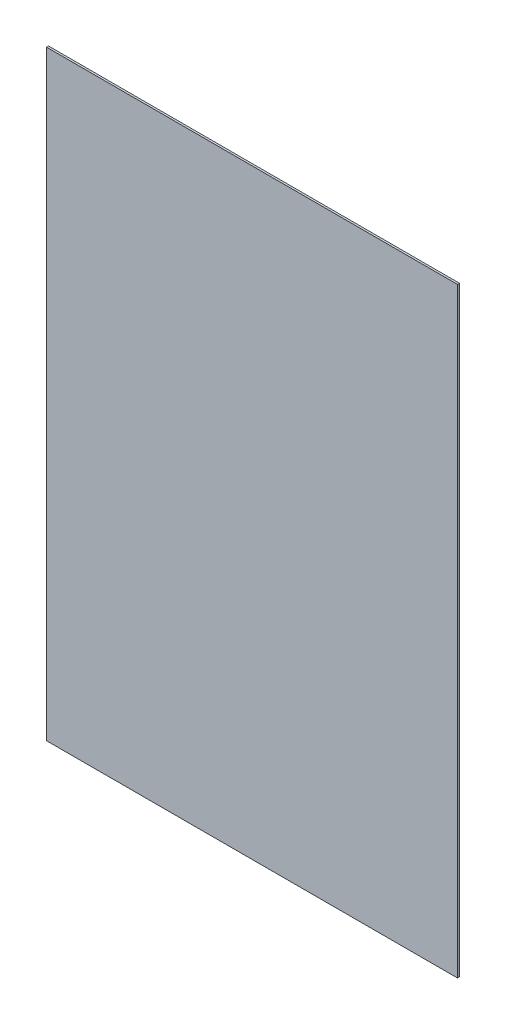
ISO-10303-21;
HEADER;
FILE_DESCRIPTION(('STEP AP214'),'2;1');
FILE_NAME('part.step','',(''),(''),'','','');
FILE_SCHEMA(('AUTOMOTIVE_DESIGN { 1 0 10303 214 1 1 1 1 }'));
ENDSEC;
DATA;
#1=APPLICATION_CONTEXT('core data for automotive mechanical design processes');
#2=APPLICATION_PROTOCOL_DEFINITION('international standard','automotive_design',2000,#1);
#3=PRODUCT_CONTEXT('',#1,'mechanical');
#4=PRODUCT('Part','Part','',(#3));
#5=PRODUCT_RELATED_PRODUCT_CATEGORY('part','',(#4));
#6=PRODUCT_DEFINITION_FORMATION('','',#4);
#7=PRODUCT_DEFINITION_CONTEXT('part definition',#1,'design');
#8=PRODUCT_DEFINITION('design','',#6,#7);
#9=PRODUCT_DEFINITION_SHAPE('','',#8);
#10=(LENGTH_UNIT() NAMED_UNIT(*) SI_UNIT(.MILLI.,.METRE.));
#11=(NAMED_UNIT(*) PLANE_ANGLE_UNIT() SI_UNIT($,.RADIAN.));
#12=(NAMED_UNIT(*) SI_UNIT($,.STERADIAN.) SOLID_ANGLE_UNIT());
#13=UNCERTAINTY_MEASURE_WITH_UNIT(LENGTH_MEASURE(1.E-05),#10,'distance_accuracy_value','');
#14=(GEOMETRIC_REPRESENTATION_CONTEXT(3) GLOBAL_UNCERTAINTY_ASSIGNED_CONTEXT((#13)) GLOBAL_UNIT_ASSIGNED_CONTEXT((#10,
#11,#12)) REPRESENTATION_CONTEXT('',''));
#15=CARTESIAN_POINT('',(0.,0.,0.));
#16=DIRECTION('',(0.,0.,1.));
#17=DIRECTION('',(1.,0.,0.));
#18=AXIS2_PLACEMENT_3D('',#15,#16,#17);
#19=CARTESIAN_POINT('',(324.765,474.765,3.175));
#20=DIRECTION('',(-1.,0.,0.));
#21=DIRECTION('',(0.,-1.,0.));
#22=AXIS2_PLACEMENT_3D('',#19,#20,#21);
#23=PLANE('',#22);
#24=DIRECTION('',(0.,1.,0.));
#25=VECTOR('',#24,1.);
#26=CARTESIAN_POINT('',(324.765,474.765,0.));
#27=LINE('',#26,#25);
#28=CARTESIAN_POINT('',(324.765,-474.765,0.));
#29=VERTEX_POINT('',#28);
#30=CARTESIAN_POINT('',(324.765,474.765,0.));
#31=VERTEX_POINT('',#30);
#32=EDGE_CURVE('E113',#29,#31,#27,.T.);
#33=ORIENTED_EDGE('',*,*,#32,.T.);
#34=DIRECTION('',(0.,0.,-1.));
#35=VECTOR('',#34,1.);
#36=CARTESIAN_POINT('',(324.765,474.765,3.175));
#37=LINE('',#36,#35);
#38=CARTESIAN_POINT('',(324.765,474.765,3.175));
#39=VERTEX_POINT('',#38);
#40=EDGE_CURVE('E11',#39,#31,#37,.T.);
#41=ORIENTED_EDGE('',*,*,#40,.F.);
#42=DIRECTION('',(0.,1.,0.));
#43=VECTOR('',#42,1.);
#44=CARTESIAN_POINT('',(324.765,474.765,3.175));
#45=LINE('',#44,#43);
#46=CARTESIAN_POINT('',(324.765,-474.765,3.175));
#47=VERTEX_POINT('',#46);
#48=EDGE_CURVE('E97',#47,#39,#45,.T.);
#49=ORIENTED_EDGE('',*,*,#48,.F.);
#50=DIRECTION('',(0.,0.,-1.));
#51=VECTOR('',#50,1.);
#52=CARTESIAN_POINT('',(324.765,-474.765,3.175));
#53=LINE('',#52,#51);
#54=EDGE_CURVE('E109',#47,#29,#53,.T.);
#55=ORIENTED_EDGE('',*,*,#54,.T.);
#56=EDGE_LOOP('',(#33,#41,#49,#55));
#57=FACE_BOUND('',#56,.T.);
#58=ADVANCED_FACE('F45',(#57),#23,.F.);
#59=CARTESIAN_POINT('',(-324.765,474.765,3.175));
#60=DIRECTION('',(0.,-1.,0.));
#61=DIRECTION('',(0.,0.,-1.));
#62=AXIS2_PLACEMENT_3D('',#59,#60,#61);
#63=PLANE('',#62);
#64=DIRECTION('',(-1.,0.,0.));
#65=VECTOR('',#64,1.);
#66=CARTESIAN_POINT('',(-324.765,474.765,0.));
#67=LINE('',#66,#65);
#68=CARTESIAN_POINT('',(-324.765,474.765,0.));
#69=VERTEX_POINT('',#68);
#70=EDGE_CURVE('E102',#31,#69,#67,.T.);
#71=ORIENTED_EDGE('',*,*,#70,.T.);
#72=DIRECTION('',(0.,0.,-1.));
#73=VECTOR('',#72,1.);
#74=CARTESIAN_POINT('',(-324.765,474.765,3.175));
#75=LINE('',#74,#73);
#76=CARTESIAN_POINT('',(-324.765,474.765,3.175));
#77=VERTEX_POINT('',#76);
#78=EDGE_CURVE('E54',#77,#69,#75,.T.);
#79=ORIENTED_EDGE('',*,*,#78,.F.);
#80=DIRECTION('',(-1.,0.,0.));
#81=VECTOR('',#80,1.);
#82=CARTESIAN_POINT('',(-324.765,474.765,3.175));
#83=LINE('',#82,#81);
#84=EDGE_CURVE('E92',#39,#77,#83,.T.);
#85=ORIENTED_EDGE('',*,*,#84,.F.);
#86=ORIENTED_EDGE('',*,*,#40,.T.);
#87=EDGE_LOOP('',(#71,#79,#85,#86));
#88=FACE_BOUND('',#87,.T.);
#89=ADVANCED_FACE('F101',(#88),#63,.F.);
#90=CARTESIAN_POINT('',(-324.765,474.765,3.175));
#91=DIRECTION('',(1.,0.,0.));
#92=DIRECTION('',(0.,1.,0.));
#93=AXIS2_PLACEMENT_3D('',#90,#91,#92);
#94=PLANE('',#93);
#95=DIRECTION('',(0.,-1.,0.));
#96=VECTOR('',#95,1.);
#97=CARTESIAN_POINT('',(-324.765,474.765,0.));
#98=LINE('',#97,#96);
#99=CARTESIAN_POINT('',(-324.765,-474.765,0.));
#100=VERTEX_POINT('',#99);
#101=EDGE_CURVE('E79',#69,#100,#98,.T.);
#102=ORIENTED_EDGE('',*,*,#101,.T.);
#103=DIRECTION('',(0.,0.,-1.));
#104=VECTOR('',#103,1.);
#105=CARTESIAN_POINT('',(-324.765,-474.765,3.175));
#106=LINE('',#105,#104);
#107=CARTESIAN_POINT('',(-324.765,-474.765,3.175));
#108=VERTEX_POINT('',#107);
#109=EDGE_CURVE('E104',#108,#100,#106,.T.);
#110=ORIENTED_EDGE('',*,*,#109,.F.);
#111=DIRECTION('',(0.,-1.,0.));
#112=VECTOR('',#111,1.);
#113=CARTESIAN_POINT('',(-324.765,474.765,3.175));
#114=LINE('',#113,#112);
#115=EDGE_CURVE('E95',#77,#108,#114,.T.);
#116=ORIENTED_EDGE('',*,*,#115,.F.);
#117=ORIENTED_EDGE('',*,*,#78,.T.);
#118=EDGE_LOOP('',(#102,#110,#116,#117));
#119=FACE_BOUND('',#118,.T.);
#120=ADVANCED_FACE('F105',(#119),#94,.F.);
#121=CARTESIAN_POINT('',(-324.765,-474.765,3.175));
#122=DIRECTION('',(0.,1.,0.));
#123=DIRECTION('',(0.,0.,1.));
#124=AXIS2_PLACEMENT_3D('',#121,#122,#123);
#125=PLANE('',#124);
#126=DIRECTION('',(1.,0.,0.));
#127=VECTOR('',#126,1.);
#128=CARTESIAN_POINT('',(-324.765,-474.765,0.));
#129=LINE('',#128,#127);
#130=EDGE_CURVE('E85',#100,#29,#129,.T.);
#131=ORIENTED_EDGE('',*,*,#130,.T.);
#132=ORIENTED_EDGE('',*,*,#54,.F.);
#133=DIRECTION('',(1.,0.,0.));
#134=VECTOR('',#133,1.);
#135=CARTESIAN_POINT('',(-324.765,-474.765,3.175));
#136=LINE('',#135,#134);
#137=EDGE_CURVE('E62',#108,#47,#136,.T.);
#138=ORIENTED_EDGE('',*,*,#137,.F.);
#139=ORIENTED_EDGE('',*,*,#109,.T.);
#140=EDGE_LOOP('',(#131,#132,#138,#139));
#141=FACE_BOUND('',#140,.T.);
#142=ADVANCED_FACE('F126',(#141),#125,.F.);
#143=CARTESIAN_POINT('',(0.,0.,3.175));
#144=DIRECTION('',(0.,0.,1.));
#145=DIRECTION('',(1.,0.,0.));
#146=AXIS2_PLACEMENT_3D('',#143,#144,#145);
#147=PLANE('',#146);
#148=ORIENTED_EDGE('',*,*,#48,.T.);
#149=ORIENTED_EDGE('',*,*,#84,.T.);
#150=ORIENTED_EDGE('',*,*,#115,.T.);
#151=ORIENTED_EDGE('',*,*,#137,.T.);
#152=EDGE_LOOP('',(#148,#149,#150,#151));
#153=FACE_BOUND('',#152,.T.);
#154=ADVANCED_FACE('F93',(#153),#147,.T.);
#155=CARTESIAN_POINT('',(0.,0.,0.));
#156=DIRECTION('',(0.,0.,1.));
#157=DIRECTION('',(1.,0.,0.));
#158=AXIS2_PLACEMENT_3D('',#155,#156,#157);
#159=PLANE('',#158);
#160=ORIENTED_EDGE('',*,*,#32,.F.);
#161=ORIENTED_EDGE('',*,*,#130,.F.);
#162=ORIENTED_EDGE('',*,*,#101,.F.);
#163=ORIENTED_EDGE('',*,*,#70,.F.);
#164=EDGE_LOOP('',(#160,#161,#162,#163));
#165=FACE_BOUND('',#164,.T.);
#166=ADVANCED_FACE('F129',(#165),#159,.F.);
#167=CLOSED_SHELL('',(#58,#89,#120,#142,#154,#166));
#168=MANIFOLD_SOLID_BREP('B2',#167);
#169=ADVANCED_BREP_SHAPE_REPRESENTATION('',(#18,#168),#14);
#170=SHAPE_DEFINITION_REPRESENTATION(#9,#169);
ENDSEC;
END-ISO-10303-21;
